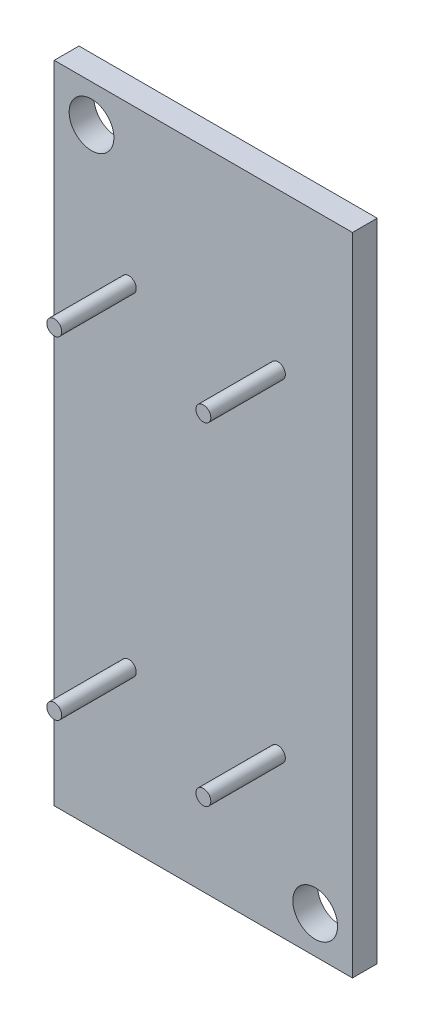
ISO-10303-21;
HEADER;
FILE_DESCRIPTION(('STEP AP214'),'2;1');
FILE_NAME('part.step','',(''),(''),'','','');
FILE_SCHEMA(('AUTOMOTIVE_DESIGN { 1 0 10303 214 1 1 1 1 }'));
ENDSEC;
DATA;
#1=APPLICATION_CONTEXT('core data for automotive mechanical design processes');
#2=APPLICATION_PROTOCOL_DEFINITION('international standard','automotive_design',2000,#1);
#3=PRODUCT_CONTEXT('',#1,'mechanical');
#4=PRODUCT('Part','Part','',(#3));
#5=PRODUCT_RELATED_PRODUCT_CATEGORY('part','',(#4));
#6=PRODUCT_DEFINITION_FORMATION('','',#4);
#7=PRODUCT_DEFINITION_CONTEXT('part definition',#1,'design');
#8=PRODUCT_DEFINITION('design','',#6,#7);
#9=PRODUCT_DEFINITION_SHAPE('','',#8);
#10=(LENGTH_UNIT() NAMED_UNIT(*) SI_UNIT(.MILLI.,.METRE.));
#11=(NAMED_UNIT(*) PLANE_ANGLE_UNIT() SI_UNIT($,.RADIAN.));
#12=(NAMED_UNIT(*) SI_UNIT($,.STERADIAN.) SOLID_ANGLE_UNIT());
#13=UNCERTAINTY_MEASURE_WITH_UNIT(LENGTH_MEASURE(1.E-05),#10,'distance_accuracy_value','');
#14=(GEOMETRIC_REPRESENTATION_CONTEXT(3) GLOBAL_UNCERTAINTY_ASSIGNED_CONTEXT((#13)) GLOBAL_UNIT_ASSIGNED_CONTEXT((#10,
#11,#12)) REPRESENTATION_CONTEXT('',''));
#15=CARTESIAN_POINT('',(0.,0.,0.));
#16=DIRECTION('',(0.,0.,1.));
#17=DIRECTION('',(1.,0.,0.));
#18=AXIS2_PLACEMENT_3D('',#15,#16,#17);
#19=CARTESIAN_POINT('',(-5.506,10.634,1.66));
#20=DIRECTION('',(0.,0.,1.));
#21=DIRECTION('',(1.,0.,0.));
#22=AXIS2_PLACEMENT_3D('',#19,#20,#21);
#23=PLANE('',#22);
#24=CARTESIAN_POINT('',(-5.,11.14,1.66));
#25=DIRECTION('',(0.,0.,-1.));
#26=DIRECTION('',(-1.,0.,0.));
#27=AXIS2_PLACEMENT_3D('',#24,#25,#26);
#28=CIRCLE('',#27,0.5);
#29=CARTESIAN_POINT('',(-5.5,11.14,1.66));
#30=VERTEX_POINT('',#29);
#31=EDGE_CURVE('P0_E18',#30,#30,#28,.T.);
#32=ORIENTED_EDGE('',*,*,#31,.T.);
#33=EDGE_LOOP('',(#32));
#34=FACE_BOUND('',#33,.T.);
#35=ADVANCED_FACE('P0_F14',(#34),#23,.F.);
#36=CARTESIAN_POINT('',(-5.506,10.634,6.66));
#37=DIRECTION('',(0.,0.,1.));
#38=DIRECTION('',(1.,0.,0.));
#39=AXIS2_PLACEMENT_3D('',#36,#37,#38);
#40=PLANE('',#39);
#41=CARTESIAN_POINT('',(-5.,11.14,6.66));
#42=DIRECTION('',(0.,0.,-1.));
#43=DIRECTION('',(-1.,0.,0.));
#44=AXIS2_PLACEMENT_3D('',#41,#42,#43);
#45=CIRCLE('',#44,0.5);
#46=CARTESIAN_POINT('',(-5.5,11.14,6.66));
#47=VERTEX_POINT('',#46);
#48=EDGE_CURVE('P0_E10',#47,#47,#45,.F.);
#49=ORIENTED_EDGE('',*,*,#48,.T.);
#50=EDGE_LOOP('',(#49));
#51=FACE_BOUND('',#50,.T.);
#52=ADVANCED_FACE('P0_F16',(#51),#40,.T.);
#53=CARTESIAN_POINT('',(-5.,11.14,6.66));
#54=DIRECTION('',(0.,0.,-1.));
#55=DIRECTION('',(-1.,0.,0.));
#56=AXIS2_PLACEMENT_3D('',#53,#54,#55);
#57=CYLINDRICAL_SURFACE('',#56,0.5);
#58=ORIENTED_EDGE('',*,*,#31,.F.);
#59=EDGE_LOOP('',(#58));
#60=FACE_BOUND('',#59,.T.);
#61=ORIENTED_EDGE('',*,*,#48,.F.);
#62=EDGE_LOOP('',(#61));
#63=FACE_BOUND('',#62,.T.);
#64=ADVANCED_FACE('P0_F28',(#60,#63),#57,.T.);
#65=CLOSED_SHELL('',(#35,#52,#64));
#66=MANIFOLD_SOLID_BREP('P0_B1',#65);
#67=CARTESIAN_POINT('',(4.494,10.634,1.66));
#68=DIRECTION('',(0.,0.,1.));
#69=DIRECTION('',(1.,0.,0.));
#70=AXIS2_PLACEMENT_3D('',#67,#68,#69);
#71=PLANE('',#70);
#72=CARTESIAN_POINT('',(5.,11.14,1.66));
#73=DIRECTION('',(0.,0.,-1.));
#74=DIRECTION('',(-1.,0.,0.));
#75=AXIS2_PLACEMENT_3D('',#72,#73,#74);
#76=CIRCLE('',#75,0.5);
#77=CARTESIAN_POINT('',(4.5,11.14,1.66));
#78=VERTEX_POINT('',#77);
#79=EDGE_CURVE('P1_E18',#78,#78,#76,.T.);
#80=ORIENTED_EDGE('',*,*,#79,.T.);
#81=EDGE_LOOP('',(#80));
#82=FACE_BOUND('',#81,.T.);
#83=ADVANCED_FACE('P1_F14',(#82),#71,.F.);
#84=CARTESIAN_POINT('',(4.494,10.634,6.66));
#85=DIRECTION('',(0.,0.,1.));
#86=DIRECTION('',(1.,0.,0.));
#87=AXIS2_PLACEMENT_3D('',#84,#85,#86);
#88=PLANE('',#87);
#89=CARTESIAN_POINT('',(5.,11.14,6.66));
#90=DIRECTION('',(0.,0.,-1.));
#91=DIRECTION('',(-1.,0.,0.));
#92=AXIS2_PLACEMENT_3D('',#89,#90,#91);
#93=CIRCLE('',#92,0.5);
#94=CARTESIAN_POINT('',(4.5,11.14,6.66));
#95=VERTEX_POINT('',#94);
#96=EDGE_CURVE('P1_E10',#95,#95,#93,.F.);
#97=ORIENTED_EDGE('',*,*,#96,.T.);
#98=EDGE_LOOP('',(#97));
#99=FACE_BOUND('',#98,.T.);
#100=ADVANCED_FACE('P1_F16',(#99),#88,.T.);
#101=CARTESIAN_POINT('',(5.,11.14,6.66));
#102=DIRECTION('',(0.,0.,-1.));
#103=DIRECTION('',(-1.,0.,0.));
#104=AXIS2_PLACEMENT_3D('',#101,#102,#103);
#105=CYLINDRICAL_SURFACE('',#104,0.5);
#106=ORIENTED_EDGE('',*,*,#79,.F.);
#107=EDGE_LOOP('',(#106));
#108=FACE_BOUND('',#107,.T.);
#109=ORIENTED_EDGE('',*,*,#96,.F.);
#110=EDGE_LOOP('',(#109));
#111=FACE_BOUND('',#110,.T.);
#112=ADVANCED_FACE('P1_F28',(#108,#111),#105,.T.);
#113=CLOSED_SHELL('',(#83,#100,#112));
#114=MANIFOLD_SOLID_BREP('P1_B1',#113);
#115=CARTESIAN_POINT('',(-10.,-21.65,1.66));
#116=DIRECTION('',(1.,0.,0.));
#117=DIRECTION('',(0.,0.,-1.));
#118=AXIS2_PLACEMENT_3D('',#115,#116,#117);
#119=PLANE('',#118);
#120=DIRECTION('',(0.,0.,1.));
#121=VECTOR('',#120,1.);
#122=CARTESIAN_POINT('',(-10.,-21.65,0.83));
#123=LINE('',#122,#121);
#124=CARTESIAN_POINT('',(-10.,-21.65,0.));
#125=VERTEX_POINT('',#124);
#126=CARTESIAN_POINT('',(-10.,-21.65,1.66));
#127=VERTEX_POINT('',#126);
#128=EDGE_CURVE('P2_E56',#125,#127,#123,.T.);
#129=ORIENTED_EDGE('',*,*,#128,.T.);
#130=DIRECTION('',(0.,-1.,0.));
#131=VECTOR('',#130,1.);
#132=CARTESIAN_POINT('',(-10.,0.,1.66));
#133=LINE('',#132,#131);
#134=CARTESIAN_POINT('',(-10.,21.65,1.66));
#135=VERTEX_POINT('',#134);
#136=EDGE_CURVE('P2_E98',#135,#127,#133,.T.);
#137=ORIENTED_EDGE('',*,*,#136,.F.);
#138=DIRECTION('',(0.,0.,-1.));
#139=VECTOR('',#138,1.);
#140=CARTESIAN_POINT('',(-10.,21.65,0.83));
#141=LINE('',#140,#139);
#142=CARTESIAN_POINT('',(-10.,21.65,0.));
#143=VERTEX_POINT('',#142);
#144=EDGE_CURVE('P2_E78',#135,#143,#141,.T.);
#145=ORIENTED_EDGE('',*,*,#144,.T.);
#146=DIRECTION('',(0.,-1.,0.));
#147=VECTOR('',#146,1.);
#148=CARTESIAN_POINT('',(-10.,0.,0.));
#149=LINE('',#148,#147);
#150=EDGE_CURVE('P2_E100',#143,#125,#149,.T.);
#151=ORIENTED_EDGE('',*,*,#150,.T.);
#152=EDGE_LOOP('',(#129,#137,#145,#151));
#153=FACE_BOUND('',#152,.T.);
#154=ADVANCED_FACE('P2_F16',(#153),#119,.F.);
#155=CARTESIAN_POINT('',(-10.,-21.65,0.));
#156=DIRECTION('',(0.,1.,0.));
#157=DIRECTION('',(0.,0.,1.));
#158=AXIS2_PLACEMENT_3D('',#155,#156,#157);
#159=PLANE('',#158);
#160=DIRECTION('',(0.,0.,1.));
#161=VECTOR('',#160,1.);
#162=CARTESIAN_POINT('',(10.,-21.65,0.83));
#163=LINE('',#162,#161);
#164=CARTESIAN_POINT('',(10.,-21.65,0.));
#165=VERTEX_POINT('',#164);
#166=CARTESIAN_POINT('',(10.,-21.65,1.66));
#167=VERTEX_POINT('',#166);
#168=EDGE_CURVE('P2_E62',#165,#167,#163,.T.);
#169=ORIENTED_EDGE('',*,*,#168,.T.);
#170=DIRECTION('',(1.,0.,0.));
#171=VECTOR('',#170,1.);
#172=CARTESIAN_POINT('',(0.,-21.65,1.66));
#173=LINE('',#172,#171);
#174=EDGE_CURVE('P2_E94',#127,#167,#173,.T.);
#175=ORIENTED_EDGE('',*,*,#174,.F.);
#176=ORIENTED_EDGE('',*,*,#128,.F.);
#177=DIRECTION('',(1.,0.,0.));
#178=VECTOR('',#177,1.);
#179=CARTESIAN_POINT('',(0.,-21.65,0.));
#180=LINE('',#179,#178);
#181=EDGE_CURVE('P2_E72',#125,#165,#180,.T.);
#182=ORIENTED_EDGE('',*,*,#181,.T.);
#183=EDGE_LOOP('',(#169,#175,#176,#182));
#184=FACE_BOUND('',#183,.T.);
#185=ADVANCED_FACE('P2_F77',(#184),#159,.F.);
#186=CARTESIAN_POINT('',(10.,-21.65,0.));
#187=DIRECTION('',(-1.,0.,0.));
#188=DIRECTION('',(0.,0.,1.));
#189=AXIS2_PLACEMENT_3D('',#186,#187,#188);
#190=PLANE('',#189);
#191=DIRECTION('',(0.,0.,1.));
#192=VECTOR('',#191,1.);
#193=CARTESIAN_POINT('',(10.,21.65,0.83));
#194=LINE('',#193,#192);
#195=CARTESIAN_POINT('',(10.,21.65,0.));
#196=VERTEX_POINT('',#195);
#197=CARTESIAN_POINT('',(10.,21.65,1.66));
#198=VERTEX_POINT('',#197);
#199=EDGE_CURVE('P2_E66',#196,#198,#194,.T.);
#200=ORIENTED_EDGE('',*,*,#199,.T.);
#201=DIRECTION('',(0.,1.,0.));
#202=VECTOR('',#201,1.);
#203=CARTESIAN_POINT('',(10.,0.,1.66));
#204=LINE('',#203,#202);
#205=EDGE_CURVE('P2_E35',#167,#198,#204,.T.);
#206=ORIENTED_EDGE('',*,*,#205,.F.);
#207=ORIENTED_EDGE('',*,*,#168,.F.);
#208=DIRECTION('',(0.,1.,0.));
#209=VECTOR('',#208,1.);
#210=CARTESIAN_POINT('',(10.,0.,0.));
#211=LINE('',#210,#209);
#212=EDGE_CURVE('P2_E65',#165,#196,#211,.T.);
#213=ORIENTED_EDGE('',*,*,#212,.T.);
#214=EDGE_LOOP('',(#200,#206,#207,#213));
#215=FACE_BOUND('',#214,.T.);
#216=ADVANCED_FACE('P2_F64',(#215),#190,.F.);
#217=CARTESIAN_POINT('',(-10.,21.65,1.66));
#218=DIRECTION('',(0.,-1.,0.));
#219=DIRECTION('',(0.,0.,-1.));
#220=AXIS2_PLACEMENT_3D('',#217,#218,#219);
#221=PLANE('',#220);
#222=ORIENTED_EDGE('',*,*,#144,.F.);
#223=DIRECTION('',(-1.,0.,0.));
#224=VECTOR('',#223,1.);
#225=CARTESIAN_POINT('',(0.,21.65,1.66));
#226=LINE('',#225,#224);
#227=EDGE_CURVE('P2_E88',#198,#135,#226,.T.);
#228=ORIENTED_EDGE('',*,*,#227,.F.);
#229=ORIENTED_EDGE('',*,*,#199,.F.);
#230=DIRECTION('',(-1.,0.,0.));
#231=VECTOR('',#230,1.);
#232=CARTESIAN_POINT('',(0.,21.65,0.));
#233=LINE('',#232,#231);
#234=EDGE_CURVE('P2_E75',#196,#143,#233,.T.);
#235=ORIENTED_EDGE('',*,*,#234,.T.);
#236=EDGE_LOOP('',(#222,#228,#229,#235));
#237=FACE_BOUND('',#236,.T.);
#238=ADVANCED_FACE('P2_F102',(#237),#221,.F.);
#239=CARTESIAN_POINT('',(7.5,-19.15,0.));
#240=DIRECTION('',(0.,0.,1.));
#241=DIRECTION('',(1.,0.,0.));
#242=AXIS2_PLACEMENT_3D('',#239,#240,#241);
#243=CYLINDRICAL_SURFACE('',#242,1.5);
#244=CARTESIAN_POINT('',(7.5,-19.15,1.66));
#245=DIRECTION('',(0.,0.,1.));
#246=DIRECTION('',(1.,0.,0.));
#247=AXIS2_PLACEMENT_3D('',#244,#245,#246);
#248=CIRCLE('',#247,1.5);
#249=CARTESIAN_POINT('',(9.,-19.15,1.66));
#250=VERTEX_POINT('',#249);
#251=EDGE_CURVE('P2_E86',#250,#250,#248,.F.);
#252=ORIENTED_EDGE('',*,*,#251,.F.);
#253=EDGE_LOOP('',(#252));
#254=FACE_BOUND('',#253,.T.);
#255=CARTESIAN_POINT('',(7.5,-19.15,0.));
#256=DIRECTION('',(0.,0.,1.));
#257=DIRECTION('',(1.,0.,0.));
#258=AXIS2_PLACEMENT_3D('',#255,#256,#257);
#259=CIRCLE('',#258,1.5);
#260=CARTESIAN_POINT('',(9.,-19.15,0.));
#261=VERTEX_POINT('',#260);
#262=EDGE_CURVE('P2_E20',#261,#261,#259,.F.);
#263=ORIENTED_EDGE('',*,*,#262,.T.);
#264=EDGE_LOOP('',(#263));
#265=FACE_BOUND('',#264,.T.);
#266=ADVANCED_FACE('P2_F113',(#254,#265),#243,.F.);
#267=CARTESIAN_POINT('',(-10.,-21.65,0.));
#268=DIRECTION('',(0.,0.,1.));
#269=DIRECTION('',(1.,0.,0.));
#270=AXIS2_PLACEMENT_3D('',#267,#268,#269);
#271=PLANE('',#270);
#272=ORIENTED_EDGE('',*,*,#262,.F.);
#273=EDGE_LOOP('',(#272));
#274=FACE_BOUND('',#273,.T.);
#275=CARTESIAN_POINT('',(-7.5,19.15,0.));
#276=DIRECTION('',(0.,0.,1.));
#277=DIRECTION('',(1.,0.,0.));
#278=AXIS2_PLACEMENT_3D('',#275,#276,#277);
#279=CIRCLE('',#278,1.5);
#280=CARTESIAN_POINT('',(-6.,19.15,0.));
#281=VERTEX_POINT('',#280);
#282=EDGE_CURVE('P2_E26',#281,#281,#279,.F.);
#283=ORIENTED_EDGE('',*,*,#282,.F.);
#284=EDGE_LOOP('',(#283));
#285=FACE_BOUND('',#284,.T.);
#286=ORIENTED_EDGE('',*,*,#234,.F.);
#287=ORIENTED_EDGE('',*,*,#212,.F.);
#288=ORIENTED_EDGE('',*,*,#181,.F.);
#289=ORIENTED_EDGE('',*,*,#150,.F.);
#290=EDGE_LOOP('',(#286,#287,#288,#289));
#291=FACE_BOUND('',#290,.T.);
#292=ADVANCED_FACE('P2_F70',(#274,#285,#291),#271,.F.);
#293=CARTESIAN_POINT('',(-10.,-21.65,1.66));
#294=DIRECTION('',(0.,0.,1.));
#295=DIRECTION('',(1.,0.,0.));
#296=AXIS2_PLACEMENT_3D('',#293,#294,#295);
#297=PLANE('',#296);
#298=ORIENTED_EDGE('',*,*,#251,.T.);
#299=EDGE_LOOP('',(#298));
#300=FACE_BOUND('',#299,.T.);
#301=CARTESIAN_POINT('',(-7.5,19.15,1.66));
#302=DIRECTION('',(0.,0.,1.));
#303=DIRECTION('',(1.,0.,0.));
#304=AXIS2_PLACEMENT_3D('',#301,#302,#303);
#305=CIRCLE('',#304,1.5);
#306=CARTESIAN_POINT('',(-6.,19.15,1.66));
#307=VERTEX_POINT('',#306);
#308=EDGE_CURVE('P2_E11',#307,#307,#305,.T.);
#309=ORIENTED_EDGE('',*,*,#308,.F.);
#310=EDGE_LOOP('',(#309));
#311=FACE_BOUND('',#310,.T.);
#312=ORIENTED_EDGE('',*,*,#205,.T.);
#313=ORIENTED_EDGE('',*,*,#227,.T.);
#314=ORIENTED_EDGE('',*,*,#136,.T.);
#315=ORIENTED_EDGE('',*,*,#174,.T.);
#316=EDGE_LOOP('',(#312,#313,#314,#315));
#317=FACE_BOUND('',#316,.T.);
#318=ADVANCED_FACE('P2_F18',(#300,#311,#317),#297,.T.);
#319=CARTESIAN_POINT('',(-7.5,19.15,0.));
#320=DIRECTION('',(0.,0.,1.));
#321=DIRECTION('',(1.,0.,0.));
#322=AXIS2_PLACEMENT_3D('',#319,#320,#321);
#323=CYLINDRICAL_SURFACE('',#322,1.5);
#324=ORIENTED_EDGE('',*,*,#282,.T.);
#325=EDGE_LOOP('',(#324));
#326=FACE_BOUND('',#325,.T.);
#327=ORIENTED_EDGE('',*,*,#308,.T.);
#328=EDGE_LOOP('',(#327));
#329=FACE_BOUND('',#328,.T.);
#330=ADVANCED_FACE('P2_F105',(#326,#329),#323,.F.);
#331=CLOSED_SHELL('',(#154,#185,#216,#238,#266,#292,#318,#330));
#332=MANIFOLD_SOLID_BREP('P2_B1',#331);
#333=CARTESIAN_POINT('',(-5.506,-11.646,1.66));
#334=DIRECTION('',(0.,0.,1.));
#335=DIRECTION('',(1.,0.,0.));
#336=AXIS2_PLACEMENT_3D('',#333,#334,#335);
#337=PLANE('',#336);
#338=CARTESIAN_POINT('',(-5.,-11.14,1.66));
#339=DIRECTION('',(0.,0.,-1.));
#340=DIRECTION('',(-1.,0.,0.));
#341=AXIS2_PLACEMENT_3D('',#338,#339,#340);
#342=CIRCLE('',#341,0.5);
#343=CARTESIAN_POINT('',(-5.5,-11.14,1.66));
#344=VERTEX_POINT('',#343);
#345=EDGE_CURVE('P3_E18',#344,#344,#342,.T.);
#346=ORIENTED_EDGE('',*,*,#345,.T.);
#347=EDGE_LOOP('',(#346));
#348=FACE_BOUND('',#347,.T.);
#349=ADVANCED_FACE('P3_F14',(#348),#337,.F.);
#350=CARTESIAN_POINT('',(-5.506,-11.646,6.66));
#351=DIRECTION('',(0.,0.,1.));
#352=DIRECTION('',(1.,0.,0.));
#353=AXIS2_PLACEMENT_3D('',#350,#351,#352);
#354=PLANE('',#353);
#355=CARTESIAN_POINT('',(-5.,-11.14,6.66));
#356=DIRECTION('',(0.,0.,-1.));
#357=DIRECTION('',(-1.,0.,0.));
#358=AXIS2_PLACEMENT_3D('',#355,#356,#357);
#359=CIRCLE('',#358,0.5);
#360=CARTESIAN_POINT('',(-5.5,-11.14,6.66));
#361=VERTEX_POINT('',#360);
#362=EDGE_CURVE('P3_E10',#361,#361,#359,.F.);
#363=ORIENTED_EDGE('',*,*,#362,.T.);
#364=EDGE_LOOP('',(#363));
#365=FACE_BOUND('',#364,.T.);
#366=ADVANCED_FACE('P3_F16',(#365),#354,.T.);
#367=CARTESIAN_POINT('',(-5.,-11.14,6.66));
#368=DIRECTION('',(0.,0.,-1.));
#369=DIRECTION('',(-1.,0.,0.));
#370=AXIS2_PLACEMENT_3D('',#367,#368,#369);
#371=CYLINDRICAL_SURFACE('',#370,0.5);
#372=ORIENTED_EDGE('',*,*,#345,.F.);
#373=EDGE_LOOP('',(#372));
#374=FACE_BOUND('',#373,.T.);
#375=ORIENTED_EDGE('',*,*,#362,.F.);
#376=EDGE_LOOP('',(#375));
#377=FACE_BOUND('',#376,.T.);
#378=ADVANCED_FACE('P3_F28',(#374,#377),#371,.T.);
#379=CLOSED_SHELL('',(#349,#366,#378));
#380=MANIFOLD_SOLID_BREP('P3_B1',#379);
#381=CARTESIAN_POINT('',(4.494,-11.646,1.66));
#382=DIRECTION('',(0.,0.,1.));
#383=DIRECTION('',(1.,0.,0.));
#384=AXIS2_PLACEMENT_3D('',#381,#382,#383);
#385=PLANE('',#384);
#386=CARTESIAN_POINT('',(5.,-11.14,1.66));
#387=DIRECTION('',(0.,0.,-1.));
#388=DIRECTION('',(-1.,0.,0.));
#389=AXIS2_PLACEMENT_3D('',#386,#387,#388);
#390=CIRCLE('',#389,0.5);
#391=CARTESIAN_POINT('',(4.5,-11.14,1.66));
#392=VERTEX_POINT('',#391);
#393=EDGE_CURVE('P4_E18',#392,#392,#390,.T.);
#394=ORIENTED_EDGE('',*,*,#393,.T.);
#395=EDGE_LOOP('',(#394));
#396=FACE_BOUND('',#395,.T.);
#397=ADVANCED_FACE('P4_F14',(#396),#385,.F.);
#398=CARTESIAN_POINT('',(4.494,-11.646,6.66));
#399=DIRECTION('',(0.,0.,1.));
#400=DIRECTION('',(1.,0.,0.));
#401=AXIS2_PLACEMENT_3D('',#398,#399,#400);
#402=PLANE('',#401);
#403=CARTESIAN_POINT('',(5.,-11.14,6.66));
#404=DIRECTION('',(0.,0.,-1.));
#405=DIRECTION('',(-1.,0.,0.));
#406=AXIS2_PLACEMENT_3D('',#403,#404,#405);
#407=CIRCLE('',#406,0.5);
#408=CARTESIAN_POINT('',(4.5,-11.14,6.66));
#409=VERTEX_POINT('',#408);
#410=EDGE_CURVE('P4_E10',#409,#409,#407,.F.);
#411=ORIENTED_EDGE('',*,*,#410,.T.);
#412=EDGE_LOOP('',(#411));
#413=FACE_BOUND('',#412,.T.);
#414=ADVANCED_FACE('P4_F16',(#413),#402,.T.);
#415=CARTESIAN_POINT('',(5.,-11.14,6.66));
#416=DIRECTION('',(0.,0.,-1.));
#417=DIRECTION('',(-1.,0.,0.));
#418=AXIS2_PLACEMENT_3D('',#415,#416,#417);
#419=CYLINDRICAL_SURFACE('',#418,0.5);
#420=ORIENTED_EDGE('',*,*,#393,.F.);
#421=EDGE_LOOP('',(#420));
#422=FACE_BOUND('',#421,.T.);
#423=ORIENTED_EDGE('',*,*,#410,.F.);
#424=EDGE_LOOP('',(#423));
#425=FACE_BOUND('',#424,.T.);
#426=ADVANCED_FACE('P4_F28',(#422,#425),#419,.T.);
#427=CLOSED_SHELL('',(#397,#414,#426));
#428=MANIFOLD_SOLID_BREP('P4_B1',#427);
#429=ADVANCED_BREP_SHAPE_REPRESENTATION('',(#18,#66,#114,#332,#380,#428),#14);
#430=SHAPE_DEFINITION_REPRESENTATION(#9,#429);
ENDSEC;
END-ISO-10303-21;
